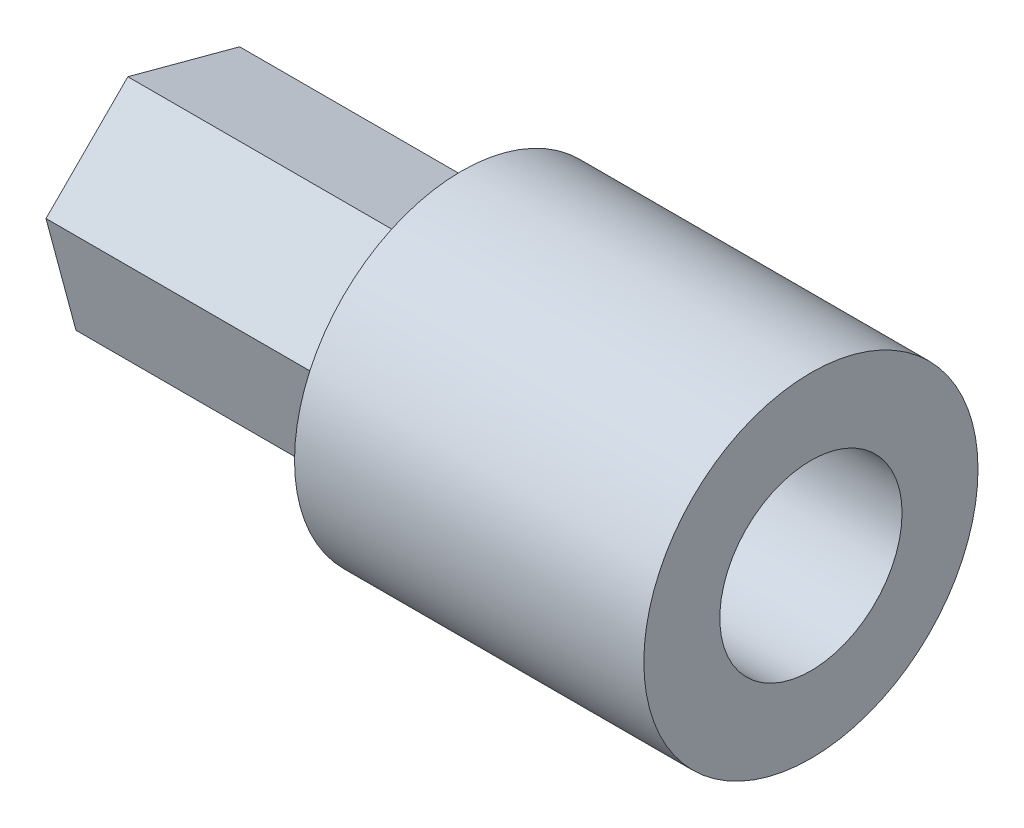
ISO-10303-21;
HEADER;
FILE_DESCRIPTION(('STEP AP214'),'2;1');
FILE_NAME('part.step','',(''),(''),'','','');
FILE_SCHEMA(('AUTOMOTIVE_DESIGN { 1 0 10303 214 1 1 1 1 }'));
ENDSEC;
DATA;
#1=APPLICATION_CONTEXT('core data for automotive mechanical design processes');
#2=APPLICATION_PROTOCOL_DEFINITION('international standard','automotive_design',2000,#1);
#3=PRODUCT_CONTEXT('',#1,'mechanical');
#4=PRODUCT('Part','Part','',(#3));
#5=PRODUCT_RELATED_PRODUCT_CATEGORY('part','',(#4));
#6=PRODUCT_DEFINITION_FORMATION('','',#4);
#7=PRODUCT_DEFINITION_CONTEXT('part definition',#1,'design');
#8=PRODUCT_DEFINITION('design','',#6,#7);
#9=PRODUCT_DEFINITION_SHAPE('','',#8);
#10=(LENGTH_UNIT() NAMED_UNIT(*) SI_UNIT(.MILLI.,.METRE.));
#11=(NAMED_UNIT(*) PLANE_ANGLE_UNIT() SI_UNIT($,.RADIAN.));
#12=(NAMED_UNIT(*) SI_UNIT($,.STERADIAN.) SOLID_ANGLE_UNIT());
#13=UNCERTAINTY_MEASURE_WITH_UNIT(LENGTH_MEASURE(1.E-05),#10,'distance_accuracy_value','');
#14=(GEOMETRIC_REPRESENTATION_CONTEXT(3) GLOBAL_UNCERTAINTY_ASSIGNED_CONTEXT((#13)) GLOBAL_UNIT_ASSIGNED_CONTEXT((#10,
#11,#12)) REPRESENTATION_CONTEXT('',''));
#15=CARTESIAN_POINT('',(0.,0.,0.));
#16=DIRECTION('',(0.,0.,1.));
#17=DIRECTION('',(1.,0.,0.));
#18=AXIS2_PLACEMENT_3D('',#15,#16,#17);
#19=CARTESIAN_POINT('',(10.,-2.33345237791559,-2.33345237791562));
#20=DIRECTION('',(0.,0.707106781186544,0.707106781186551));
#21=DIRECTION('',(0.,-0.707106781186551,0.707106781186544));
#22=AXIS2_PLACEMENT_3D('',#19,#20,#21);
#23=PLANE('',#22);
#24=DIRECTION('',(0.,0.707106781186551,-0.707106781186544));
#25=VECTOR('',#24,1.);
#26=CARTESIAN_POINT('',(0.,-2.33345237791559,-2.33345237791562));
#27=LINE('',#26,#25);
#28=CARTESIAN_POINT('',(0.,-3.68067173644635,-0.98623301938488));
#29=VERTEX_POINT('',#28);
#30=CARTESIAN_POINT('',(0.,-0.98623301938484,-3.68067173644636));
#31=VERTEX_POINT('',#30);
#32=EDGE_CURVE('E139',#29,#31,#27,.T.);
#33=ORIENTED_EDGE('',*,*,#32,.T.);
#34=DIRECTION('',(-1.,0.,0.));
#35=VECTOR('',#34,1.);
#36=CARTESIAN_POINT('',(10.,-0.98623301938484,-3.68067173644636));
#37=LINE('',#36,#35);
#38=CARTESIAN_POINT('',(10.,-0.98623301938484,-3.68067173644636));
#39=VERTEX_POINT('',#38);
#40=EDGE_CURVE('E11',#39,#31,#37,.T.);
#41=ORIENTED_EDGE('',*,*,#40,.F.);
#42=DIRECTION('',(0.,0.707106781186551,-0.707106781186544));
#43=VECTOR('',#42,1.);
#44=CARTESIAN_POINT('',(10.,-2.33345237791559,-2.33345237791562));
#45=LINE('',#44,#43);
#46=CARTESIAN_POINT('',(10.,-3.68067173644635,-0.98623301938488));
#47=VERTEX_POINT('',#46);
#48=EDGE_CURVE('E129',#47,#39,#45,.T.);
#49=ORIENTED_EDGE('',*,*,#48,.F.);
#50=DIRECTION('',(-1.,0.,0.));
#51=VECTOR('',#50,1.);
#52=CARTESIAN_POINT('',(10.,-3.68067173644635,-0.98623301938488));
#53=LINE('',#52,#51);
#54=EDGE_CURVE('E138',#47,#29,#53,.T.);
#55=ORIENTED_EDGE('',*,*,#54,.T.);
#56=EDGE_LOOP('',(#33,#41,#49,#55));
#57=FACE_BOUND('',#56,.T.);
#58=ADVANCED_FACE('F41',(#57),#23,.F.);
#59=CARTESIAN_POINT('',(10.,0.854102848838336,-3.18755522675392));
#60=DIRECTION('',(0.,-0.258819045102526,0.965925826289067));
#61=DIRECTION('',(0.,-0.965925826289067,-0.258819045102526));
#62=AXIS2_PLACEMENT_3D('',#59,#60,#61);
#63=PLANE('',#62);
#64=DIRECTION('',(0.,0.965925826289067,0.258819045102526));
#65=VECTOR('',#64,1.);
#66=CARTESIAN_POINT('',(0.,0.854102848838336,-3.18755522675392));
#67=LINE('',#66,#65);
#68=CARTESIAN_POINT('',(0.,2.69443871706151,-2.69443871706148));
#69=VERTEX_POINT('',#68);
#70=EDGE_CURVE('E143',#31,#69,#67,.T.);
#71=ORIENTED_EDGE('',*,*,#70,.T.);
#72=DIRECTION('',(-1.,0.,0.));
#73=VECTOR('',#72,1.);
#74=CARTESIAN_POINT('',(10.,2.69443871706151,-2.69443871706148));
#75=LINE('',#74,#73);
#76=CARTESIAN_POINT('',(10.,2.69443871706151,-2.69443871706148));
#77=VERTEX_POINT('',#76);
#78=EDGE_CURVE('E50',#77,#69,#75,.T.);
#79=ORIENTED_EDGE('',*,*,#78,.F.);
#80=DIRECTION('',(0.,0.965925826289067,0.258819045102526));
#81=VECTOR('',#80,1.);
#82=CARTESIAN_POINT('',(10.,0.854102848838336,-3.18755522675392));
#83=LINE('',#82,#81);
#84=EDGE_CURVE('E94',#39,#77,#83,.T.);
#85=ORIENTED_EDGE('',*,*,#84,.F.);
#86=ORIENTED_EDGE('',*,*,#40,.T.);
#87=EDGE_LOOP('',(#71,#79,#85,#86));
#88=FACE_BOUND('',#87,.T.);
#89=ADVANCED_FACE('F225',(#88),#63,.F.);
#90=CARTESIAN_POINT('',(10.,3.18755522675393,-0.854102848838302));
#91=DIRECTION('',(0.,-0.96592582628907,0.258819045102516));
#92=DIRECTION('',(0.,-0.258819045102516,-0.96592582628907));
#93=AXIS2_PLACEMENT_3D('',#90,#91,#92);
#94=PLANE('',#93);
#95=DIRECTION('',(0.,0.258819045102516,0.96592582628907));
#96=VECTOR('',#95,1.);
#97=CARTESIAN_POINT('',(0.,3.18755522675393,-0.854102848838302));
#98=LINE('',#97,#96);
#99=CARTESIAN_POINT('',(0.,3.68067173644635,0.986233019384879));
#100=VERTEX_POINT('',#99);
#101=EDGE_CURVE('E109',#69,#100,#98,.T.);
#102=ORIENTED_EDGE('',*,*,#101,.T.);
#103=DIRECTION('',(-1.,0.,0.));
#104=VECTOR('',#103,1.);
#105=CARTESIAN_POINT('',(10.,3.68067173644635,0.986233019384879));
#106=LINE('',#105,#104);
#107=CARTESIAN_POINT('',(10.,3.68067173644635,0.986233019384879));
#108=VERTEX_POINT('',#107);
#109=EDGE_CURVE('E102',#108,#100,#106,.T.);
#110=ORIENTED_EDGE('',*,*,#109,.F.);
#111=DIRECTION('',(0.,0.258819045102516,0.96592582628907));
#112=VECTOR('',#111,1.);
#113=CARTESIAN_POINT('',(10.,3.18755522675393,-0.854102848838302));
#114=LINE('',#113,#112);
#115=EDGE_CURVE('E107',#77,#108,#114,.T.);
#116=ORIENTED_EDGE('',*,*,#115,.F.);
#117=ORIENTED_EDGE('',*,*,#78,.T.);
#118=EDGE_LOOP('',(#102,#110,#116,#117));
#119=FACE_BOUND('',#118,.T.);
#120=ADVANCED_FACE('F104',(#119),#94,.F.);
#121=CARTESIAN_POINT('',(10.,2.33345237791559,2.33345237791562));
#122=DIRECTION('',(0.,-0.707106781186544,-0.707106781186551));
#123=DIRECTION('',(0.,0.707106781186551,-0.707106781186544));
#124=AXIS2_PLACEMENT_3D('',#121,#122,#123);
#125=PLANE('',#124);
#126=DIRECTION('',(0.,-0.707106781186551,0.707106781186544));
#127=VECTOR('',#126,1.);
#128=CARTESIAN_POINT('',(0.,2.33345237791559,2.33345237791562));
#129=LINE('',#128,#127);
#130=CARTESIAN_POINT('',(0.,0.986233019384839,3.68067173644636));
#131=VERTEX_POINT('',#130);
#132=EDGE_CURVE('E149',#100,#131,#129,.T.);
#133=ORIENTED_EDGE('',*,*,#132,.T.);
#134=DIRECTION('',(-1.,0.,0.));
#135=VECTOR('',#134,1.);
#136=CARTESIAN_POINT('',(10.,0.986233019384839,3.68067173644636));
#137=LINE('',#136,#135);
#138=CARTESIAN_POINT('',(10.,0.986233019384839,3.68067173644636));
#139=VERTEX_POINT('',#138);
#140=EDGE_CURVE('E113',#139,#131,#137,.T.);
#141=ORIENTED_EDGE('',*,*,#140,.F.);
#142=DIRECTION('',(0.,-0.707106781186551,0.707106781186544));
#143=VECTOR('',#142,1.);
#144=CARTESIAN_POINT('',(10.,2.33345237791559,2.33345237791562));
#145=LINE('',#144,#143);
#146=EDGE_CURVE('E116',#108,#139,#145,.T.);
#147=ORIENTED_EDGE('',*,*,#146,.F.);
#148=ORIENTED_EDGE('',*,*,#109,.T.);
#149=EDGE_LOOP('',(#133,#141,#147,#148));
#150=FACE_BOUND('',#149,.T.);
#151=ADVANCED_FACE('F117',(#150),#125,.F.);
#152=CARTESIAN_POINT('',(10.,-0.854102848838337,3.18755522675392));
#153=DIRECTION('',(0.,0.258819045102526,-0.965925826289067));
#154=DIRECTION('',(0.,0.965925826289067,0.258819045102526));
#155=AXIS2_PLACEMENT_3D('',#152,#153,#154);
#156=PLANE('',#155);
#157=DIRECTION('',(0.,-0.965925826289067,-0.258819045102526));
#158=VECTOR('',#157,1.);
#159=CARTESIAN_POINT('',(0.,-0.854102848838337,3.18755522675392));
#160=LINE('',#159,#158);
#161=CARTESIAN_POINT('',(0.,-2.69443871706151,2.69443871706148));
#162=VERTEX_POINT('',#161);
#163=EDGE_CURVE('E80',#131,#162,#160,.T.);
#164=ORIENTED_EDGE('',*,*,#163,.T.);
#165=DIRECTION('',(-1.,0.,0.));
#166=VECTOR('',#165,1.);
#167=CARTESIAN_POINT('',(10.,-2.69443871706151,2.69443871706148));
#168=LINE('',#167,#166);
#169=CARTESIAN_POINT('',(10.,-2.69443871706151,2.69443871706148));
#170=VERTEX_POINT('',#169);
#171=EDGE_CURVE('E58',#170,#162,#168,.T.);
#172=ORIENTED_EDGE('',*,*,#171,.F.);
#173=DIRECTION('',(0.,-0.965925826289067,-0.258819045102526));
#174=VECTOR('',#173,1.);
#175=CARTESIAN_POINT('',(10.,-0.854102848838337,3.18755522675392));
#176=LINE('',#175,#174);
#177=EDGE_CURVE('E121',#139,#170,#176,.T.);
#178=ORIENTED_EDGE('',*,*,#177,.F.);
#179=ORIENTED_EDGE('',*,*,#140,.T.);
#180=EDGE_LOOP('',(#164,#172,#178,#179));
#181=FACE_BOUND('',#180,.T.);
#182=ADVANCED_FACE('F165',(#181),#156,.F.);
#183=CARTESIAN_POINT('',(10.,-3.18755522675393,0.8541028488383));
#184=DIRECTION('',(0.,0.96592582628907,-0.258819045102515));
#185=DIRECTION('',(0.,0.258819045102515,0.96592582628907));
#186=AXIS2_PLACEMENT_3D('',#183,#184,#185);
#187=PLANE('',#186);
#188=DIRECTION('',(0.,-0.258819045102515,-0.96592582628907));
#189=VECTOR('',#188,1.);
#190=CARTESIAN_POINT('',(0.,-3.18755522675393,0.8541028488383));
#191=LINE('',#190,#189);
#192=EDGE_CURVE('E86',#162,#29,#191,.T.);
#193=ORIENTED_EDGE('',*,*,#192,.T.);
#194=ORIENTED_EDGE('',*,*,#54,.F.);
#195=DIRECTION('',(0.,-0.258819045102515,-0.96592582628907));
#196=VECTOR('',#195,1.);
#197=CARTESIAN_POINT('',(10.,-3.18755522675393,0.8541028488383));
#198=LINE('',#197,#196);
#199=EDGE_CURVE('E135',#170,#47,#198,.T.);
#200=ORIENTED_EDGE('',*,*,#199,.F.);
#201=ORIENTED_EDGE('',*,*,#171,.T.);
#202=EDGE_LOOP('',(#193,#194,#200,#201));
#203=FACE_BOUND('',#202,.T.);
#204=ADVANCED_FACE('F167',(#203),#187,.F.);
#205=CARTESIAN_POINT('',(0.,0.,0.));
#206=DIRECTION('',(1.,0.,0.));
#207=DIRECTION('',(0.,0.,-1.));
#208=AXIS2_PLACEMENT_3D('',#205,#206,#207);
#209=PLANE('',#208);
#210=CARTESIAN_POINT('',(0.,0.,0.));
#211=DIRECTION('',(1.,0.,0.));
#212=DIRECTION('',(0.,0.,-1.));
#213=AXIS2_PLACEMENT_3D('',#210,#211,#212);
#214=CIRCLE('',#213,1.5);
#215=CARTESIAN_POINT('',(0.,0.,-1.5));
#216=VERTEX_POINT('',#215);
#217=EDGE_CURVE('E171',#216,#216,#214,.T.);
#218=ORIENTED_EDGE('',*,*,#217,.T.);
#219=EDGE_LOOP('',(#218));
#220=FACE_BOUND('',#219,.T.);
#221=ORIENTED_EDGE('',*,*,#32,.F.);
#222=ORIENTED_EDGE('',*,*,#192,.F.);
#223=ORIENTED_EDGE('',*,*,#163,.F.);
#224=ORIENTED_EDGE('',*,*,#132,.F.);
#225=ORIENTED_EDGE('',*,*,#101,.F.);
#226=ORIENTED_EDGE('',*,*,#70,.F.);
#227=EDGE_LOOP('',(#221,#222,#223,#224,#225,#226));
#228=FACE_BOUND('',#227,.T.);
#229=ADVANCED_FACE('F164',(#220,#228),#209,.F.);
#230=CARTESIAN_POINT('',(4.5,0.,0.));
#231=DIRECTION('',(-1.,0.,0.));
#232=DIRECTION('',(0.,0.,1.));
#233=AXIS2_PLACEMENT_3D('',#230,#231,#232);
#234=CYLINDRICAL_SURFACE('',#233,1.5);
#235=CARTESIAN_POINT('',(4.5,0.,0.));
#236=DIRECTION('',(1.,0.,0.));
#237=DIRECTION('',(0.,0.,-1.));
#238=AXIS2_PLACEMENT_3D('',#235,#236,#237);
#239=CIRCLE('',#238,1.5);
#240=CARTESIAN_POINT('',(4.5,0.,-1.5));
#241=VERTEX_POINT('',#240);
#242=EDGE_CURVE('E144',#241,#241,#239,.T.);
#243=ORIENTED_EDGE('',*,*,#242,.T.);
#244=EDGE_LOOP('',(#243));
#245=FACE_BOUND('',#244,.T.);
#246=ORIENTED_EDGE('',*,*,#217,.F.);
#247=EDGE_LOOP('',(#246));
#248=FACE_BOUND('',#247,.T.);
#249=ADVANCED_FACE('F221',(#245,#248),#234,.F.);
#250=CARTESIAN_POINT('',(4.5,0.,0.));
#251=DIRECTION('',(1.,0.,0.));
#252=DIRECTION('',(0.,0.,-1.));
#253=AXIS2_PLACEMENT_3D('',#250,#251,#252);
#254=PLANE('',#253);
#255=ORIENTED_EDGE('',*,*,#242,.F.);
#256=EDGE_LOOP('',(#255));
#257=FACE_BOUND('',#256,.T.);
#258=ADVANCED_FACE('F216',(#257),#254,.F.);
#259=CARTESIAN_POINT('',(10.,0.,0.));
#260=DIRECTION('',(1.,0.,0.));
#261=DIRECTION('',(0.,0.,-1.));
#262=AXIS2_PLACEMENT_3D('',#259,#260,#261);
#263=PLANE('',#262);
#264=CARTESIAN_POINT('',(10.,0.,0.));
#265=DIRECTION('',(1.,0.,0.));
#266=DIRECTION('',(0.,0.,-1.));
#267=AXIS2_PLACEMENT_3D('',#264,#265,#266);
#268=CIRCLE('',#267,5.5);
#269=CARTESIAN_POINT('',(10.,0.,-5.5));
#270=VERTEX_POINT('',#269);
#271=EDGE_CURVE('E179',#270,#270,#268,.T.);
#272=ORIENTED_EDGE('',*,*,#271,.F.);
#273=EDGE_LOOP('',(#272));
#274=FACE_BOUND('',#273,.T.);
#275=ORIENTED_EDGE('',*,*,#199,.T.);
#276=ORIENTED_EDGE('',*,*,#48,.T.);
#277=ORIENTED_EDGE('',*,*,#84,.T.);
#278=ORIENTED_EDGE('',*,*,#115,.T.);
#279=ORIENTED_EDGE('',*,*,#146,.T.);
#280=ORIENTED_EDGE('',*,*,#177,.T.);
#281=EDGE_LOOP('',(#275,#276,#277,#278,#279,#280));
#282=FACE_BOUND('',#281,.T.);
#283=ADVANCED_FACE('F124',(#274,#282),#263,.F.);
#284=CARTESIAN_POINT('',(21.5,0.,0.));
#285=DIRECTION('',(-1.,0.,0.));
#286=DIRECTION('',(0.,0.,1.));
#287=AXIS2_PLACEMENT_3D('',#284,#285,#286);
#288=CYLINDRICAL_SURFACE('',#287,5.5);
#289=CARTESIAN_POINT('',(21.5,0.,0.));
#290=DIRECTION('',(1.,0.,0.));
#291=DIRECTION('',(0.,0.,-1.));
#292=AXIS2_PLACEMENT_3D('',#289,#290,#291);
#293=CIRCLE('',#292,5.5);
#294=CARTESIAN_POINT('',(21.5,0.,-5.5));
#295=VERTEX_POINT('',#294);
#296=EDGE_CURVE('E175',#295,#295,#293,.T.);
#297=ORIENTED_EDGE('',*,*,#296,.F.);
#298=EDGE_LOOP('',(#297));
#299=FACE_BOUND('',#298,.T.);
#300=ORIENTED_EDGE('',*,*,#271,.T.);
#301=EDGE_LOOP('',(#300));
#302=FACE_BOUND('',#301,.T.);
#303=ADVANCED_FACE('F206',(#299,#302),#288,.T.);
#304=CARTESIAN_POINT('',(21.5,0.,0.));
#305=DIRECTION('',(1.,0.,0.));
#306=DIRECTION('',(0.,0.,-1.));
#307=AXIS2_PLACEMENT_3D('',#304,#305,#306);
#308=PLANE('',#307);
#309=CARTESIAN_POINT('',(21.5,0.,0.));
#310=DIRECTION('',(1.,0.,0.));
#311=DIRECTION('',(0.,0.,-1.));
#312=AXIS2_PLACEMENT_3D('',#309,#310,#311);
#313=CIRCLE('',#312,3.);
#314=CARTESIAN_POINT('',(21.5,0.,-3.));
#315=VERTEX_POINT('',#314);
#316=EDGE_CURVE('E187',#315,#315,#313,.T.);
#317=ORIENTED_EDGE('',*,*,#316,.F.);
#318=EDGE_LOOP('',(#317));
#319=FACE_BOUND('',#318,.T.);
#320=ORIENTED_EDGE('',*,*,#296,.T.);
#321=EDGE_LOOP('',(#320));
#322=FACE_BOUND('',#321,.T.);
#323=ADVANCED_FACE('F200',(#319,#322),#308,.T.);
#324=CARTESIAN_POINT('',(12.,0.,0.));
#325=DIRECTION('',(1.,0.,0.));
#326=DIRECTION('',(0.,0.,-1.));
#327=AXIS2_PLACEMENT_3D('',#324,#325,#326);
#328=CYLINDRICAL_SURFACE('',#327,3.);
#329=CARTESIAN_POINT('',(12.,0.,0.));
#330=DIRECTION('',(1.,0.,0.));
#331=DIRECTION('',(0.,0.,-1.));
#332=AXIS2_PLACEMENT_3D('',#329,#330,#331);
#333=CIRCLE('',#332,3.);
#334=CARTESIAN_POINT('',(12.,0.,-3.));
#335=VERTEX_POINT('',#334);
#336=EDGE_CURVE('E183',#335,#335,#333,.T.);
#337=ORIENTED_EDGE('',*,*,#336,.F.);
#338=EDGE_LOOP('',(#337));
#339=FACE_BOUND('',#338,.T.);
#340=ORIENTED_EDGE('',*,*,#316,.T.);
#341=EDGE_LOOP('',(#340));
#342=FACE_BOUND('',#341,.T.);
#343=ADVANCED_FACE('F197',(#339,#342),#328,.F.);
#344=CARTESIAN_POINT('',(12.,0.,0.));
#345=DIRECTION('',(1.,0.,0.));
#346=DIRECTION('',(0.,0.,-1.));
#347=AXIS2_PLACEMENT_3D('',#344,#345,#346);
#348=PLANE('',#347);
#349=ORIENTED_EDGE('',*,*,#336,.T.);
#350=EDGE_LOOP('',(#349));
#351=FACE_BOUND('',#350,.T.);
#352=ADVANCED_FACE('F195',(#351),#348,.T.);
#353=CLOSED_SHELL('',(#58,#89,#120,#151,#182,#204,#229,#249,#258,#283,#303,#323,#343,#352));
#354=MANIFOLD_SOLID_BREP('B2',#353);
#355=ADVANCED_BREP_SHAPE_REPRESENTATION('',(#18,#354),#14);
#356=SHAPE_DEFINITION_REPRESENTATION(#9,#355);
ENDSEC;
END-ISO-10303-21;
